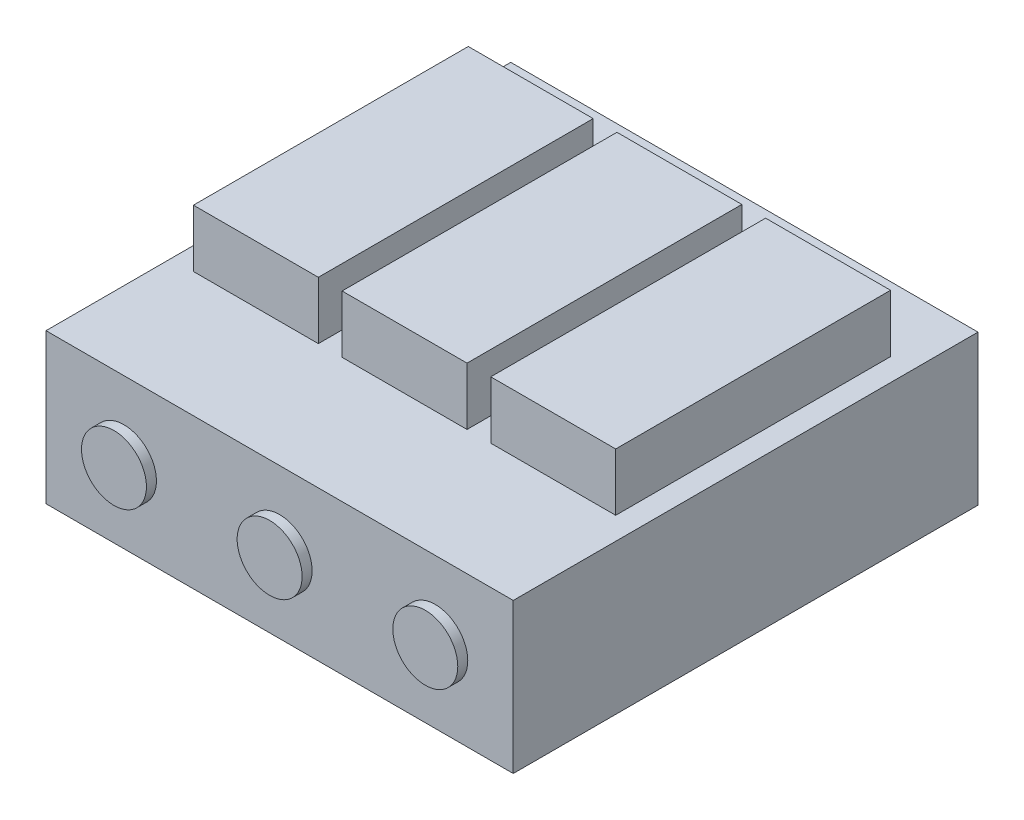
ISO-10303-21;
HEADER;
FILE_DESCRIPTION(('STEP AP214'),'2;1');
FILE_NAME('part.step','',(''),(''),'','','');
FILE_SCHEMA(('AUTOMOTIVE_DESIGN { 1 0 10303 214 1 1 1 1 }'));
ENDSEC;
DATA;
#1=APPLICATION_CONTEXT('core data for automotive mechanical design processes');
#2=APPLICATION_PROTOCOL_DEFINITION('international standard','automotive_design',2000,#1);
#3=PRODUCT_CONTEXT('',#1,'mechanical');
#4=PRODUCT('Part','Part','',(#3));
#5=PRODUCT_RELATED_PRODUCT_CATEGORY('part','',(#4));
#6=PRODUCT_DEFINITION_FORMATION('','',#4);
#7=PRODUCT_DEFINITION_CONTEXT('part definition',#1,'design');
#8=PRODUCT_DEFINITION('design','',#6,#7);
#9=PRODUCT_DEFINITION_SHAPE('','',#8);
#10=(LENGTH_UNIT() NAMED_UNIT(*) SI_UNIT(.MILLI.,.METRE.));
#11=(NAMED_UNIT(*) PLANE_ANGLE_UNIT() SI_UNIT($,.RADIAN.));
#12=(NAMED_UNIT(*) SI_UNIT($,.STERADIAN.) SOLID_ANGLE_UNIT());
#13=UNCERTAINTY_MEASURE_WITH_UNIT(LENGTH_MEASURE(1.E-05),#10,'distance_accuracy_value','');
#14=(GEOMETRIC_REPRESENTATION_CONTEXT(3) GLOBAL_UNCERTAINTY_ASSIGNED_CONTEXT((#13)) GLOBAL_UNIT_ASSIGNED_CONTEXT((#10,
#11,#12)) REPRESENTATION_CONTEXT('',''));
#15=CARTESIAN_POINT('',(0.,0.,0.));
#16=DIRECTION('',(0.,0.,1.));
#17=DIRECTION('',(1.,0.,0.));
#18=AXIS2_PLACEMENT_3D('',#15,#16,#17);
#19=CARTESIAN_POINT('',(15.58,3.,0.4));
#20=DIRECTION('',(0.,0.,-1.));
#21=DIRECTION('',(-1.,0.,0.));
#22=AXIS2_PLACEMENT_3D('',#19,#20,#21);
#23=CYLINDRICAL_SURFACE('',#22,1.3);
#24=CARTESIAN_POINT('',(15.58,3.,0.4));
#25=DIRECTION('',(0.,0.,1.));
#26=DIRECTION('',(1.,0.,0.));
#27=AXIS2_PLACEMENT_3D('',#24,#25,#26);
#28=CIRCLE('',#27,1.3);
#29=CARTESIAN_POINT('',(16.88,3.,0.4));
#30=VERTEX_POINT('',#29);
#31=EDGE_CURVE('E59',#30,#30,#28,.T.);
#32=ORIENTED_EDGE('',*,*,#31,.F.);
#33=EDGE_LOOP('',(#32));
#34=FACE_BOUND('',#33,.T.);
#35=CARTESIAN_POINT('',(15.58,3.,0.));
#36=DIRECTION('',(0.,0.,1.));
#37=DIRECTION('',(1.,0.,0.));
#38=AXIS2_PLACEMENT_3D('',#35,#36,#37);
#39=CIRCLE('',#38,1.3);
#40=CARTESIAN_POINT('',(16.88,3.,0.));
#41=VERTEX_POINT('',#40);
#42=EDGE_CURVE('E11',#41,#41,#39,.T.);
#43=ORIENTED_EDGE('',*,*,#42,.T.);
#44=EDGE_LOOP('',(#43));
#45=FACE_BOUND('',#44,.T.);
#46=ADVANCED_FACE('F53',(#34,#45),#23,.T.);
#47=CARTESIAN_POINT('',(15.58,3.,0.4));
#48=DIRECTION('',(0.,0.,1.));
#49=DIRECTION('',(1.,0.,0.));
#50=AXIS2_PLACEMENT_3D('',#47,#48,#49);
#51=PLANE('',#50);
#52=ORIENTED_EDGE('',*,*,#31,.T.);
#53=EDGE_LOOP('',(#52));
#54=FACE_BOUND('',#53,.T.);
#55=ADVANCED_FACE('F57',(#54),#51,.T.);
#56=CARTESIAN_POINT('',(15.58,3.,0.));
#57=DIRECTION('',(0.,0.,1.));
#58=DIRECTION('',(1.,0.,0.));
#59=AXIS2_PLACEMENT_3D('',#56,#57,#58);
#60=PLANE('',#59);
#61=ORIENTED_EDGE('',*,*,#42,.F.);
#62=EDGE_LOOP('',(#61));
#63=FACE_BOUND('',#62,.T.);
#64=ADVANCED_FACE('F71',(#63),#60,.F.);
#65=CLOSED_SHELL('',(#46,#55,#64));
#66=MANIFOLD_SOLID_BREP('B2',#65);
#67=CARTESIAN_POINT('',(9.35,3.,0.4));
#68=DIRECTION('',(0.,0.,-1.));
#69=DIRECTION('',(-1.,0.,0.));
#70=AXIS2_PLACEMENT_3D('',#67,#68,#69);
#71=CYLINDRICAL_SURFACE('',#70,1.3);
#72=CARTESIAN_POINT('',(9.35,3.,0.4));
#73=DIRECTION('',(0.,0.,1.));
#74=DIRECTION('',(1.,0.,0.));
#75=AXIS2_PLACEMENT_3D('',#72,#73,#74);
#76=CIRCLE('',#75,1.3);
#77=CARTESIAN_POINT('',(10.65,3.,0.4));
#78=VERTEX_POINT('',#77);
#79=EDGE_CURVE('E116',#78,#78,#76,.T.);
#80=ORIENTED_EDGE('',*,*,#79,.F.);
#81=EDGE_LOOP('',(#80));
#82=FACE_BOUND('',#81,.T.);
#83=CARTESIAN_POINT('',(9.35,3.,0.));
#84=DIRECTION('',(0.,0.,1.));
#85=DIRECTION('',(1.,0.,0.));
#86=AXIS2_PLACEMENT_3D('',#83,#84,#85);
#87=CIRCLE('',#86,1.3);
#88=CARTESIAN_POINT('',(10.65,3.,0.));
#89=VERTEX_POINT('',#88);
#90=EDGE_CURVE('E52',#89,#89,#87,.T.);
#91=ORIENTED_EDGE('',*,*,#90,.T.);
#92=EDGE_LOOP('',(#91));
#93=FACE_BOUND('',#92,.T.);
#94=ADVANCED_FACE('F113',(#82,#93),#71,.T.);
#95=CARTESIAN_POINT('',(9.35,3.,0.4));
#96=DIRECTION('',(0.,0.,1.));
#97=DIRECTION('',(1.,0.,0.));
#98=AXIS2_PLACEMENT_3D('',#95,#96,#97);
#99=PLANE('',#98);
#100=ORIENTED_EDGE('',*,*,#79,.T.);
#101=EDGE_LOOP('',(#100));
#102=FACE_BOUND('',#101,.T.);
#103=ADVANCED_FACE('F120',(#102),#99,.T.);
#104=CARTESIAN_POINT('',(9.35,3.,0.));
#105=DIRECTION('',(0.,0.,1.));
#106=DIRECTION('',(1.,0.,0.));
#107=AXIS2_PLACEMENT_3D('',#104,#105,#106);
#108=PLANE('',#107);
#109=ORIENTED_EDGE('',*,*,#90,.F.);
#110=EDGE_LOOP('',(#109));
#111=FACE_BOUND('',#110,.T.);
#112=ADVANCED_FACE('F131',(#111),#108,.F.);
#113=CLOSED_SHELL('',(#94,#103,#112));
#114=MANIFOLD_SOLID_BREP('B6',#113);
#115=CARTESIAN_POINT('',(3.12,3.,0.4));
#116=DIRECTION('',(0.,0.,-1.));
#117=DIRECTION('',(-1.,0.,0.));
#118=AXIS2_PLACEMENT_3D('',#115,#116,#117);
#119=CYLINDRICAL_SURFACE('',#118,1.3);
#120=CARTESIAN_POINT('',(3.12,3.,0.4));
#121=DIRECTION('',(0.,0.,1.));
#122=DIRECTION('',(1.,0.,0.));
#123=AXIS2_PLACEMENT_3D('',#120,#121,#122);
#124=CIRCLE('',#123,1.3);
#125=CARTESIAN_POINT('',(4.42,3.,0.4));
#126=VERTEX_POINT('',#125);
#127=EDGE_CURVE('E111',#126,#126,#124,.T.);
#128=ORIENTED_EDGE('',*,*,#127,.F.);
#129=EDGE_LOOP('',(#128));
#130=FACE_BOUND('',#129,.T.);
#131=CARTESIAN_POINT('',(3.12,3.,0.));
#132=DIRECTION('',(0.,0.,1.));
#133=DIRECTION('',(1.,0.,0.));
#134=AXIS2_PLACEMENT_3D('',#131,#132,#133);
#135=CIRCLE('',#134,1.3);
#136=CARTESIAN_POINT('',(4.42,3.,0.));
#137=VERTEX_POINT('',#136);
#138=EDGE_CURVE('E182',#137,#137,#135,.T.);
#139=ORIENTED_EDGE('',*,*,#138,.T.);
#140=EDGE_LOOP('',(#139));
#141=FACE_BOUND('',#140,.T.);
#142=ADVANCED_FACE('F178',(#130,#141),#119,.T.);
#143=CARTESIAN_POINT('',(3.12,3.,0.4));
#144=DIRECTION('',(0.,0.,1.));
#145=DIRECTION('',(1.,0.,0.));
#146=AXIS2_PLACEMENT_3D('',#143,#144,#145);
#147=PLANE('',#146);
#148=ORIENTED_EDGE('',*,*,#127,.T.);
#149=EDGE_LOOP('',(#148));
#150=FACE_BOUND('',#149,.T.);
#151=ADVANCED_FACE('F193',(#150),#147,.T.);
#152=CARTESIAN_POINT('',(3.12,3.,0.));
#153=DIRECTION('',(0.,0.,1.));
#154=DIRECTION('',(1.,0.,0.));
#155=AXIS2_PLACEMENT_3D('',#152,#153,#154);
#156=PLANE('',#155);
#157=ORIENTED_EDGE('',*,*,#138,.F.);
#158=EDGE_LOOP('',(#157));
#159=FACE_BOUND('',#158,.T.);
#160=ADVANCED_FACE('F192',(#159),#156,.F.);
#161=CLOSED_SHELL('',(#142,#151,#160));
#162=MANIFOLD_SOLID_BREP('B48',#161);
#163=CARTESIAN_POINT('',(12.8,8.3,-16.));
#164=DIRECTION('',(1.,0.,0.));
#165=DIRECTION('',(0.,0.,-1.));
#166=AXIS2_PLACEMENT_3D('',#163,#164,#165);
#167=PLANE('',#166);
#168=DIRECTION('',(0.,0.,1.));
#169=VECTOR('',#168,1.);
#170=CARTESIAN_POINT('',(12.8,6.,-16.));
#171=LINE('',#170,#169);
#172=CARTESIAN_POINT('',(12.8,6.,-16.));
#173=VERTEX_POINT('',#172);
#174=CARTESIAN_POINT('',(12.8,6.,-5.));
#175=VERTEX_POINT('',#174);
#176=EDGE_CURVE('E177',#173,#175,#171,.T.);
#177=ORIENTED_EDGE('',*,*,#176,.T.);
#178=DIRECTION('',(0.,-1.,0.));
#179=VECTOR('',#178,1.);
#180=CARTESIAN_POINT('',(12.8,8.3,-5.));
#181=LINE('',#180,#179);
#182=CARTESIAN_POINT('',(12.8,8.3,-5.));
#183=VERTEX_POINT('',#182);
#184=EDGE_CURVE('E315',#183,#175,#181,.T.);
#185=ORIENTED_EDGE('',*,*,#184,.F.);
#186=DIRECTION('',(0.,0.,1.));
#187=VECTOR('',#186,1.);
#188=CARTESIAN_POINT('',(12.8,8.3,-16.));
#189=LINE('',#188,#187);
#190=CARTESIAN_POINT('',(12.8,8.3,-16.));
#191=VERTEX_POINT('',#190);
#192=EDGE_CURVE('E243',#191,#183,#189,.T.);
#193=ORIENTED_EDGE('',*,*,#192,.F.);
#194=DIRECTION('',(0.,-1.,0.));
#195=VECTOR('',#194,1.);
#196=CARTESIAN_POINT('',(12.8,8.3,-16.));
#197=LINE('',#196,#195);
#198=EDGE_CURVE('E298',#191,#173,#197,.T.);
#199=ORIENTED_EDGE('',*,*,#198,.T.);
#200=EDGE_LOOP('',(#177,#185,#193,#199));
#201=FACE_BOUND('',#200,.T.);
#202=ADVANCED_FACE('F242',(#201),#167,.F.);
#203=CARTESIAN_POINT('',(12.8,8.3,-5.));
#204=DIRECTION('',(0.,0.,-1.));
#205=DIRECTION('',(-1.,0.,0.));
#206=AXIS2_PLACEMENT_3D('',#203,#204,#205);
#207=PLANE('',#206);
#208=DIRECTION('',(1.,0.,0.));
#209=VECTOR('',#208,1.);
#210=CARTESIAN_POINT('',(12.8,6.,-5.));
#211=LINE('',#210,#209);
#212=CARTESIAN_POINT('',(17.8,6.,-5.));
#213=VERTEX_POINT('',#212);
#214=EDGE_CURVE('E253',#175,#213,#211,.T.);
#215=ORIENTED_EDGE('',*,*,#214,.T.);
#216=DIRECTION('',(0.,-1.,0.));
#217=VECTOR('',#216,1.);
#218=CARTESIAN_POINT('',(17.8,8.3,-5.));
#219=LINE('',#218,#217);
#220=CARTESIAN_POINT('',(17.8,8.3,-5.));
#221=VERTEX_POINT('',#220);
#222=EDGE_CURVE('E297',#221,#213,#219,.T.);
#223=ORIENTED_EDGE('',*,*,#222,.F.);
#224=DIRECTION('',(1.,0.,0.));
#225=VECTOR('',#224,1.);
#226=CARTESIAN_POINT('',(12.8,8.3,-5.));
#227=LINE('',#226,#225);
#228=EDGE_CURVE('E274',#183,#221,#227,.T.);
#229=ORIENTED_EDGE('',*,*,#228,.F.);
#230=ORIENTED_EDGE('',*,*,#184,.T.);
#231=EDGE_LOOP('',(#215,#223,#229,#230));
#232=FACE_BOUND('',#231,.T.);
#233=ADVANCED_FACE('F312',(#232),#207,.F.);
#234=CARTESIAN_POINT('',(17.8,8.3,-16.));
#235=DIRECTION('',(-1.,0.,0.));
#236=DIRECTION('',(0.,0.,1.));
#237=AXIS2_PLACEMENT_3D('',#234,#235,#236);
#238=PLANE('',#237);
#239=DIRECTION('',(0.,0.,-1.));
#240=VECTOR('',#239,1.);
#241=CARTESIAN_POINT('',(17.8,6.,-16.));
#242=LINE('',#241,#240);
#243=CARTESIAN_POINT('',(17.8,6.,-16.));
#244=VERTEX_POINT('',#243);
#245=EDGE_CURVE('E292',#213,#244,#242,.T.);
#246=ORIENTED_EDGE('',*,*,#245,.T.);
#247=DIRECTION('',(0.,-1.,0.));
#248=VECTOR('',#247,1.);
#249=CARTESIAN_POINT('',(17.8,8.3,-16.));
#250=LINE('',#249,#248);
#251=CARTESIAN_POINT('',(17.8,8.3,-16.));
#252=VERTEX_POINT('',#251);
#253=EDGE_CURVE('E294',#252,#244,#250,.T.);
#254=ORIENTED_EDGE('',*,*,#253,.F.);
#255=DIRECTION('',(0.,0.,-1.));
#256=VECTOR('',#255,1.);
#257=CARTESIAN_POINT('',(17.8,8.3,-16.));
#258=LINE('',#257,#256);
#259=EDGE_CURVE('E306',#221,#252,#258,.T.);
#260=ORIENTED_EDGE('',*,*,#259,.F.);
#261=ORIENTED_EDGE('',*,*,#222,.T.);
#262=EDGE_LOOP('',(#246,#254,#260,#261));
#263=FACE_BOUND('',#262,.T.);
#264=ADVANCED_FACE('F295',(#263),#238,.F.);
#265=CARTESIAN_POINT('',(12.8,8.3,-16.));
#266=DIRECTION('',(0.,0.,1.));
#267=DIRECTION('',(1.,0.,0.));
#268=AXIS2_PLACEMENT_3D('',#265,#266,#267);
#269=PLANE('',#268);
#270=DIRECTION('',(-1.,0.,0.));
#271=VECTOR('',#270,1.);
#272=CARTESIAN_POINT('',(12.8,6.,-16.));
#273=LINE('',#272,#271);
#274=EDGE_CURVE('E283',#244,#173,#273,.T.);
#275=ORIENTED_EDGE('',*,*,#274,.T.);
#276=ORIENTED_EDGE('',*,*,#198,.F.);
#277=DIRECTION('',(-1.,0.,0.));
#278=VECTOR('',#277,1.);
#279=CARTESIAN_POINT('',(12.8,8.3,-16.));
#280=LINE('',#279,#278);
#281=EDGE_CURVE('E296',#252,#191,#280,.T.);
#282=ORIENTED_EDGE('',*,*,#281,.F.);
#283=ORIENTED_EDGE('',*,*,#253,.T.);
#284=EDGE_LOOP('',(#275,#276,#282,#283));
#285=FACE_BOUND('',#284,.T.);
#286=ADVANCED_FACE('F299',(#285),#269,.F.);
#287=CARTESIAN_POINT('',(0.,8.3,0.));
#288=DIRECTION('',(0.,1.,0.));
#289=DIRECTION('',(0.,0.,1.));
#290=AXIS2_PLACEMENT_3D('',#287,#288,#289);
#291=PLANE('',#290);
#292=ORIENTED_EDGE('',*,*,#192,.T.);
#293=ORIENTED_EDGE('',*,*,#228,.T.);
#294=ORIENTED_EDGE('',*,*,#259,.T.);
#295=ORIENTED_EDGE('',*,*,#281,.T.);
#296=EDGE_LOOP('',(#292,#293,#294,#295));
#297=FACE_BOUND('',#296,.T.);
#298=ADVANCED_FACE('F244',(#297),#291,.T.);
#299=CARTESIAN_POINT('',(0.,6.,0.));
#300=DIRECTION('',(0.,1.,0.));
#301=DIRECTION('',(0.,0.,1.));
#302=AXIS2_PLACEMENT_3D('',#299,#300,#301);
#303=PLANE('',#302);
#304=ORIENTED_EDGE('',*,*,#176,.F.);
#305=ORIENTED_EDGE('',*,*,#274,.F.);
#306=ORIENTED_EDGE('',*,*,#245,.F.);
#307=ORIENTED_EDGE('',*,*,#214,.F.);
#308=EDGE_LOOP('',(#304,#305,#306,#307));
#309=FACE_BOUND('',#308,.T.);
#310=ADVANCED_FACE('F305',(#309),#303,.F.);
#311=CLOSED_SHELL('',(#202,#233,#264,#286,#298,#310));
#312=MANIFOLD_SOLID_BREP('B108',#311);
#313=CARTESIAN_POINT('',(6.85,8.3,-16.));
#314=DIRECTION('',(1.,0.,0.));
#315=DIRECTION('',(0.,0.,-1.));
#316=AXIS2_PLACEMENT_3D('',#313,#314,#315);
#317=PLANE('',#316);
#318=DIRECTION('',(0.,0.,1.));
#319=VECTOR('',#318,1.);
#320=CARTESIAN_POINT('',(6.85,6.,-16.));
#321=LINE('',#320,#319);
#322=CARTESIAN_POINT('',(6.85,6.,-16.));
#323=VERTEX_POINT('',#322);
#324=CARTESIAN_POINT('',(6.85,6.,-5.));
#325=VERTEX_POINT('',#324);
#326=EDGE_CURVE('E239',#323,#325,#321,.T.);
#327=ORIENTED_EDGE('',*,*,#326,.T.);
#328=DIRECTION('',(0.,-1.,0.));
#329=VECTOR('',#328,1.);
#330=CARTESIAN_POINT('',(6.85,8.3,-5.));
#331=LINE('',#330,#329);
#332=CARTESIAN_POINT('',(6.85,8.3,-5.));
#333=VERTEX_POINT('',#332);
#334=EDGE_CURVE('E466',#333,#325,#331,.T.);
#335=ORIENTED_EDGE('',*,*,#334,.F.);
#336=DIRECTION('',(0.,0.,1.));
#337=VECTOR('',#336,1.);
#338=CARTESIAN_POINT('',(6.85,8.3,-16.));
#339=LINE('',#338,#337);
#340=CARTESIAN_POINT('',(6.85,8.3,-16.));
#341=VERTEX_POINT('',#340);
#342=EDGE_CURVE('E401',#341,#333,#339,.T.);
#343=ORIENTED_EDGE('',*,*,#342,.F.);
#344=DIRECTION('',(0.,-1.,0.));
#345=VECTOR('',#344,1.);
#346=CARTESIAN_POINT('',(6.85,8.3,-16.));
#347=LINE('',#346,#345);
#348=EDGE_CURVE('E456',#341,#323,#347,.T.);
#349=ORIENTED_EDGE('',*,*,#348,.T.);
#350=EDGE_LOOP('',(#327,#335,#343,#349));
#351=FACE_BOUND('',#350,.T.);
#352=ADVANCED_FACE('F399',(#351),#317,.F.);
#353=CARTESIAN_POINT('',(6.85,8.3,-5.));
#354=DIRECTION('',(0.,0.,-1.));
#355=DIRECTION('',(-1.,0.,0.));
#356=AXIS2_PLACEMENT_3D('',#353,#354,#355);
#357=PLANE('',#356);
#358=DIRECTION('',(1.,0.,0.));
#359=VECTOR('',#358,1.);
#360=CARTESIAN_POINT('',(6.85,6.,-5.));
#361=LINE('',#360,#359);
#362=CARTESIAN_POINT('',(11.85,6.,-5.));
#363=VERTEX_POINT('',#362);
#364=EDGE_CURVE('E406',#325,#363,#361,.T.);
#365=ORIENTED_EDGE('',*,*,#364,.T.);
#366=DIRECTION('',(0.,-1.,0.));
#367=VECTOR('',#366,1.);
#368=CARTESIAN_POINT('',(11.85,8.3,-5.));
#369=LINE('',#368,#367);
#370=CARTESIAN_POINT('',(11.85,8.3,-5.));
#371=VERTEX_POINT('',#370);
#372=EDGE_CURVE('E454',#371,#363,#369,.T.);
#373=ORIENTED_EDGE('',*,*,#372,.F.);
#374=DIRECTION('',(1.,0.,0.));
#375=VECTOR('',#374,1.);
#376=CARTESIAN_POINT('',(6.85,8.3,-5.));
#377=LINE('',#376,#375);
#378=EDGE_CURVE('E433',#333,#371,#377,.T.);
#379=ORIENTED_EDGE('',*,*,#378,.F.);
#380=ORIENTED_EDGE('',*,*,#334,.T.);
#381=EDGE_LOOP('',(#365,#373,#379,#380));
#382=FACE_BOUND('',#381,.T.);
#383=ADVANCED_FACE('F471',(#382),#357,.F.);
#384=CARTESIAN_POINT('',(11.85,8.3,-16.));
#385=DIRECTION('',(-1.,0.,0.));
#386=DIRECTION('',(0.,0.,1.));
#387=AXIS2_PLACEMENT_3D('',#384,#385,#386);
#388=PLANE('',#387);
#389=DIRECTION('',(0.,0.,-1.));
#390=VECTOR('',#389,1.);
#391=CARTESIAN_POINT('',(11.85,6.,-16.));
#392=LINE('',#391,#390);
#393=CARTESIAN_POINT('',(11.85,6.,-16.));
#394=VERTEX_POINT('',#393);
#395=EDGE_CURVE('E446',#363,#394,#392,.T.);
#396=ORIENTED_EDGE('',*,*,#395,.T.);
#397=DIRECTION('',(0.,-1.,0.));
#398=VECTOR('',#397,1.);
#399=CARTESIAN_POINT('',(11.85,8.3,-16.));
#400=LINE('',#399,#398);
#401=CARTESIAN_POINT('',(11.85,8.3,-16.));
#402=VERTEX_POINT('',#401);
#403=EDGE_CURVE('E455',#402,#394,#400,.T.);
#404=ORIENTED_EDGE('',*,*,#403,.F.);
#405=DIRECTION('',(0.,0.,-1.));
#406=VECTOR('',#405,1.);
#407=CARTESIAN_POINT('',(11.85,8.3,-16.));
#408=LINE('',#407,#406);
#409=EDGE_CURVE('E467',#371,#402,#408,.T.);
#410=ORIENTED_EDGE('',*,*,#409,.F.);
#411=ORIENTED_EDGE('',*,*,#372,.T.);
#412=EDGE_LOOP('',(#396,#404,#410,#411));
#413=FACE_BOUND('',#412,.T.);
#414=ADVANCED_FACE('F448',(#413),#388,.F.);
#415=CARTESIAN_POINT('',(6.85,8.3,-16.));
#416=DIRECTION('',(0.,0.,1.));
#417=DIRECTION('',(1.,0.,0.));
#418=AXIS2_PLACEMENT_3D('',#415,#416,#417);
#419=PLANE('',#418);
#420=DIRECTION('',(-1.,0.,0.));
#421=VECTOR('',#420,1.);
#422=CARTESIAN_POINT('',(6.85,6.,-16.));
#423=LINE('',#422,#421);
#424=EDGE_CURVE('E444',#394,#323,#423,.T.);
#425=ORIENTED_EDGE('',*,*,#424,.T.);
#426=ORIENTED_EDGE('',*,*,#348,.F.);
#427=DIRECTION('',(-1.,0.,0.));
#428=VECTOR('',#427,1.);
#429=CARTESIAN_POINT('',(6.85,8.3,-16.));
#430=LINE('',#429,#428);
#431=EDGE_CURVE('E460',#402,#341,#430,.T.);
#432=ORIENTED_EDGE('',*,*,#431,.F.);
#433=ORIENTED_EDGE('',*,*,#403,.T.);
#434=EDGE_LOOP('',(#425,#426,#432,#433));
#435=FACE_BOUND('',#434,.T.);
#436=ADVANCED_FACE('F457',(#435),#419,.F.);
#437=CARTESIAN_POINT('',(0.,8.3,0.));
#438=DIRECTION('',(0.,1.,0.));
#439=DIRECTION('',(0.,0.,1.));
#440=AXIS2_PLACEMENT_3D('',#437,#438,#439);
#441=PLANE('',#440);
#442=ORIENTED_EDGE('',*,*,#342,.T.);
#443=ORIENTED_EDGE('',*,*,#378,.T.);
#444=ORIENTED_EDGE('',*,*,#409,.T.);
#445=ORIENTED_EDGE('',*,*,#431,.T.);
#446=EDGE_LOOP('',(#442,#443,#444,#445));
#447=FACE_BOUND('',#446,.T.);
#448=ADVANCED_FACE('F402',(#447),#441,.T.);
#449=CARTESIAN_POINT('',(0.,6.,0.));
#450=DIRECTION('',(0.,1.,0.));
#451=DIRECTION('',(0.,0.,1.));
#452=AXIS2_PLACEMENT_3D('',#449,#450,#451);
#453=PLANE('',#452);
#454=ORIENTED_EDGE('',*,*,#326,.F.);
#455=ORIENTED_EDGE('',*,*,#424,.F.);
#456=ORIENTED_EDGE('',*,*,#395,.F.);
#457=ORIENTED_EDGE('',*,*,#364,.F.);
#458=EDGE_LOOP('',(#454,#455,#456,#457));
#459=FACE_BOUND('',#458,.T.);
#460=ADVANCED_FACE('F458',(#459),#453,.F.);
#461=CLOSED_SHELL('',(#352,#383,#414,#436,#448,#460));
#462=MANIFOLD_SOLID_BREP('B168',#461);
#463=CARTESIAN_POINT('',(0.9,8.3,-16.));
#464=DIRECTION('',(1.,0.,0.));
#465=DIRECTION('',(0.,0.,-1.));
#466=AXIS2_PLACEMENT_3D('',#463,#464,#465);
#467=PLANE('',#466);
#468=DIRECTION('',(0.,0.,1.));
#469=VECTOR('',#468,1.);
#470=CARTESIAN_POINT('',(0.9,6.,-16.));
#471=LINE('',#470,#469);
#472=CARTESIAN_POINT('',(0.9,6.,-16.));
#473=VERTEX_POINT('',#472);
#474=CARTESIAN_POINT('',(0.9,6.,-5.));
#475=VERTEX_POINT('',#474);
#476=EDGE_CURVE('E619',#473,#475,#471,.T.);
#477=ORIENTED_EDGE('',*,*,#476,.T.);
#478=DIRECTION('',(0.,-1.,0.));
#479=VECTOR('',#478,1.);
#480=CARTESIAN_POINT('',(0.9,8.3,-5.));
#481=LINE('',#480,#479);
#482=CARTESIAN_POINT('',(0.9,8.3,-5.));
#483=VERTEX_POINT('',#482);
#484=EDGE_CURVE('E400',#483,#475,#481,.T.);
#485=ORIENTED_EDGE('',*,*,#484,.F.);
#486=DIRECTION('',(0.,0.,1.));
#487=VECTOR('',#486,1.);
#488=CARTESIAN_POINT('',(0.9,8.3,-16.));
#489=LINE('',#488,#487);
#490=CARTESIAN_POINT('',(0.9,8.3,-16.));
#491=VERTEX_POINT('',#490);
#492=EDGE_CURVE('E610',#491,#483,#489,.T.);
#493=ORIENTED_EDGE('',*,*,#492,.F.);
#494=DIRECTION('',(0.,-1.,0.));
#495=VECTOR('',#494,1.);
#496=CARTESIAN_POINT('',(0.9,8.3,-16.));
#497=LINE('',#496,#495);
#498=EDGE_CURVE('E613',#491,#473,#497,.T.);
#499=ORIENTED_EDGE('',*,*,#498,.T.);
#500=EDGE_LOOP('',(#477,#485,#493,#499));
#501=FACE_BOUND('',#500,.T.);
#502=ADVANCED_FACE('F557',(#501),#467,.F.);
#503=CARTESIAN_POINT('',(0.9,8.3,-5.));
#504=DIRECTION('',(0.,0.,-1.));
#505=DIRECTION('',(-1.,0.,0.));
#506=AXIS2_PLACEMENT_3D('',#503,#504,#505);
#507=PLANE('',#506);
#508=DIRECTION('',(1.,0.,0.));
#509=VECTOR('',#508,1.);
#510=CARTESIAN_POINT('',(0.9,6.,-5.));
#511=LINE('',#510,#509);
#512=CARTESIAN_POINT('',(5.9,6.,-5.));
#513=VERTEX_POINT('',#512);
#514=EDGE_CURVE('E612',#475,#513,#511,.T.);
#515=ORIENTED_EDGE('',*,*,#514,.T.);
#516=DIRECTION('',(0.,-1.,0.));
#517=VECTOR('',#516,1.);
#518=CARTESIAN_POINT('',(5.9,8.3,-5.));
#519=LINE('',#518,#517);
#520=CARTESIAN_POINT('',(5.9,8.3,-5.));
#521=VERTEX_POINT('',#520);
#522=EDGE_CURVE('E564',#521,#513,#519,.T.);
#523=ORIENTED_EDGE('',*,*,#522,.F.);
#524=DIRECTION('',(1.,0.,0.));
#525=VECTOR('',#524,1.);
#526=CARTESIAN_POINT('',(0.9,8.3,-5.));
#527=LINE('',#526,#525);
#528=EDGE_CURVE('E605',#483,#521,#527,.T.);
#529=ORIENTED_EDGE('',*,*,#528,.F.);
#530=ORIENTED_EDGE('',*,*,#484,.T.);
#531=EDGE_LOOP('',(#515,#523,#529,#530));
#532=FACE_BOUND('',#531,.T.);
#533=ADVANCED_FACE('F608',(#532),#507,.F.);
#534=CARTESIAN_POINT('',(5.9,8.3,-16.));
#535=DIRECTION('',(-1.,0.,0.));
#536=DIRECTION('',(0.,0.,1.));
#537=AXIS2_PLACEMENT_3D('',#534,#535,#536);
#538=PLANE('',#537);
#539=DIRECTION('',(0.,0.,-1.));
#540=VECTOR('',#539,1.);
#541=CARTESIAN_POINT('',(5.9,6.,-16.));
#542=LINE('',#541,#540);
#543=CARTESIAN_POINT('',(5.9,6.,-16.));
#544=VERTEX_POINT('',#543);
#545=EDGE_CURVE('E589',#513,#544,#542,.T.);
#546=ORIENTED_EDGE('',*,*,#545,.T.);
#547=DIRECTION('',(0.,-1.,0.));
#548=VECTOR('',#547,1.);
#549=CARTESIAN_POINT('',(5.9,8.3,-16.));
#550=LINE('',#549,#548);
#551=CARTESIAN_POINT('',(5.9,8.3,-16.));
#552=VERTEX_POINT('',#551);
#553=EDGE_CURVE('E615',#552,#544,#550,.T.);
#554=ORIENTED_EDGE('',*,*,#553,.F.);
#555=DIRECTION('',(0.,0.,-1.));
#556=VECTOR('',#555,1.);
#557=CARTESIAN_POINT('',(5.9,8.3,-16.));
#558=LINE('',#557,#556);
#559=EDGE_CURVE('E604',#521,#552,#558,.T.);
#560=ORIENTED_EDGE('',*,*,#559,.F.);
#561=ORIENTED_EDGE('',*,*,#522,.T.);
#562=EDGE_LOOP('',(#546,#554,#560,#561));
#563=FACE_BOUND('',#562,.T.);
#564=ADVANCED_FACE('F614',(#563),#538,.F.);
#565=CARTESIAN_POINT('',(0.9,8.3,-16.));
#566=DIRECTION('',(0.,0.,1.));
#567=DIRECTION('',(1.,0.,0.));
#568=AXIS2_PLACEMENT_3D('',#565,#566,#567);
#569=PLANE('',#568);
#570=DIRECTION('',(-1.,0.,0.));
#571=VECTOR('',#570,1.);
#572=CARTESIAN_POINT('',(0.9,6.,-16.));
#573=LINE('',#572,#571);
#574=EDGE_CURVE('E594',#544,#473,#573,.T.);
#575=ORIENTED_EDGE('',*,*,#574,.T.);
#576=ORIENTED_EDGE('',*,*,#498,.F.);
#577=DIRECTION('',(-1.,0.,0.));
#578=VECTOR('',#577,1.);
#579=CARTESIAN_POINT('',(0.9,8.3,-16.));
#580=LINE('',#579,#578);
#581=EDGE_CURVE('E575',#552,#491,#580,.T.);
#582=ORIENTED_EDGE('',*,*,#581,.F.);
#583=ORIENTED_EDGE('',*,*,#553,.T.);
#584=EDGE_LOOP('',(#575,#576,#582,#583));
#585=FACE_BOUND('',#584,.T.);
#586=ADVANCED_FACE('F627',(#585),#569,.F.);
#587=CARTESIAN_POINT('',(0.,8.3,0.));
#588=DIRECTION('',(0.,1.,0.));
#589=DIRECTION('',(0.,0.,1.));
#590=AXIS2_PLACEMENT_3D('',#587,#588,#589);
#591=PLANE('',#590);
#592=ORIENTED_EDGE('',*,*,#492,.T.);
#593=ORIENTED_EDGE('',*,*,#528,.T.);
#594=ORIENTED_EDGE('',*,*,#559,.T.);
#595=ORIENTED_EDGE('',*,*,#581,.T.);
#596=EDGE_LOOP('',(#592,#593,#594,#595));
#597=FACE_BOUND('',#596,.T.);
#598=ADVANCED_FACE('F602',(#597),#591,.T.);
#599=CARTESIAN_POINT('',(0.,6.,0.));
#600=DIRECTION('',(0.,1.,0.));
#601=DIRECTION('',(0.,0.,1.));
#602=AXIS2_PLACEMENT_3D('',#599,#600,#601);
#603=PLANE('',#602);
#604=ORIENTED_EDGE('',*,*,#476,.F.);
#605=ORIENTED_EDGE('',*,*,#574,.F.);
#606=ORIENTED_EDGE('',*,*,#545,.F.);
#607=ORIENTED_EDGE('',*,*,#514,.F.);
#608=EDGE_LOOP('',(#604,#605,#606,#607));
#609=FACE_BOUND('',#608,.T.);
#610=ADVANCED_FACE('F626',(#609),#603,.F.);
#611=CLOSED_SHELL('',(#502,#533,#564,#586,#598,#610));
#612=MANIFOLD_SOLID_BREP('B233',#611);
#613=CARTESIAN_POINT('',(0.,6.,-18.6));
#614=DIRECTION('',(1.,0.,0.));
#615=DIRECTION('',(0.,0.,-1.));
#616=AXIS2_PLACEMENT_3D('',#613,#614,#615);
#617=PLANE('',#616);
#618=DIRECTION('',(0.,0.,1.));
#619=VECTOR('',#618,1.);
#620=CARTESIAN_POINT('',(0.,0.,-18.6));
#621=LINE('',#620,#619);
#622=CARTESIAN_POINT('',(0.,0.,-18.6));
#623=VERTEX_POINT('',#622);
#624=CARTESIAN_POINT('',(0.,0.,0.));
#625=VERTEX_POINT('',#624);
#626=EDGE_CURVE('E770',#623,#625,#621,.T.);
#627=ORIENTED_EDGE('',*,*,#626,.T.);
#628=DIRECTION('',(0.,-1.,0.));
#629=VECTOR('',#628,1.);
#630=CARTESIAN_POINT('',(0.,6.,0.));
#631=LINE('',#630,#629);
#632=CARTESIAN_POINT('',(0.,6.,0.));
#633=VERTEX_POINT('',#632);
#634=EDGE_CURVE('E551',#633,#625,#631,.T.);
#635=ORIENTED_EDGE('',*,*,#634,.F.);
#636=DIRECTION('',(0.,0.,1.));
#637=VECTOR('',#636,1.);
#638=CARTESIAN_POINT('',(0.,6.,-18.6));
#639=LINE('',#638,#637);
#640=CARTESIAN_POINT('',(0.,6.,-18.6));
#641=VERTEX_POINT('',#640);
#642=EDGE_CURVE('E752',#641,#633,#639,.T.);
#643=ORIENTED_EDGE('',*,*,#642,.F.);
#644=DIRECTION('',(0.,-1.,0.));
#645=VECTOR('',#644,1.);
#646=CARTESIAN_POINT('',(0.,6.,-18.6));
#647=LINE('',#646,#645);
#648=EDGE_CURVE('E763',#641,#623,#647,.T.);
#649=ORIENTED_EDGE('',*,*,#648,.T.);
#650=EDGE_LOOP('',(#627,#635,#643,#649));
#651=FACE_BOUND('',#650,.T.);
#652=ADVANCED_FACE('F702',(#651),#617,.F.);
#653=CARTESIAN_POINT('',(0.,6.,0.));
#654=DIRECTION('',(0.,0.,-1.));
#655=DIRECTION('',(-1.,0.,0.));
#656=AXIS2_PLACEMENT_3D('',#653,#654,#655);
#657=PLANE('',#656);
#658=DIRECTION('',(1.,0.,0.));
#659=VECTOR('',#658,1.);
#660=CARTESIAN_POINT('',(0.,0.,0.));
#661=LINE('',#660,#659);
#662=CARTESIAN_POINT('',(18.7,0.,0.));
#663=VERTEX_POINT('',#662);
#664=EDGE_CURVE('E757',#625,#663,#661,.T.);
#665=ORIENTED_EDGE('',*,*,#664,.T.);
#666=DIRECTION('',(0.,-1.,0.));
#667=VECTOR('',#666,1.);
#668=CARTESIAN_POINT('',(18.7,6.,0.));
#669=LINE('',#668,#667);
#670=CARTESIAN_POINT('',(18.7,6.,0.));
#671=VERTEX_POINT('',#670);
#672=EDGE_CURVE('E715',#671,#663,#669,.T.);
#673=ORIENTED_EDGE('',*,*,#672,.F.);
#674=DIRECTION('',(1.,0.,0.));
#675=VECTOR('',#674,1.);
#676=CARTESIAN_POINT('',(0.,6.,0.));
#677=LINE('',#676,#675);
#678=EDGE_CURVE('E749',#633,#671,#677,.T.);
#679=ORIENTED_EDGE('',*,*,#678,.F.);
#680=ORIENTED_EDGE('',*,*,#634,.T.);
#681=EDGE_LOOP('',(#665,#673,#679,#680));
#682=FACE_BOUND('',#681,.T.);
#683=ADVANCED_FACE('F758',(#682),#657,.F.);
#684=CARTESIAN_POINT('',(18.7,6.,-18.6));
#685=DIRECTION('',(-1.,0.,0.));
#686=DIRECTION('',(0.,0.,1.));
#687=AXIS2_PLACEMENT_3D('',#684,#685,#686);
#688=PLANE('',#687);
#689=DIRECTION('',(0.,0.,-1.));
#690=VECTOR('',#689,1.);
#691=CARTESIAN_POINT('',(18.7,0.,-18.6));
#692=LINE('',#691,#690);
#693=CARTESIAN_POINT('',(18.7,0.,-18.6));
#694=VERTEX_POINT('',#693);
#695=EDGE_CURVE('E740',#663,#694,#692,.T.);
#696=ORIENTED_EDGE('',*,*,#695,.T.);
#697=DIRECTION('',(0.,-1.,0.));
#698=VECTOR('',#697,1.);
#699=CARTESIAN_POINT('',(18.7,6.,-18.6));
#700=LINE('',#699,#698);
#701=CARTESIAN_POINT('',(18.7,6.,-18.6));
#702=VERTEX_POINT('',#701);
#703=EDGE_CURVE('E759',#702,#694,#700,.T.);
#704=ORIENTED_EDGE('',*,*,#703,.F.);
#705=DIRECTION('',(0.,0.,-1.));
#706=VECTOR('',#705,1.);
#707=CARTESIAN_POINT('',(18.7,6.,-18.6));
#708=LINE('',#707,#706);
#709=EDGE_CURVE('E751',#671,#702,#708,.T.);
#710=ORIENTED_EDGE('',*,*,#709,.F.);
#711=ORIENTED_EDGE('',*,*,#672,.T.);
#712=EDGE_LOOP('',(#696,#704,#710,#711));
#713=FACE_BOUND('',#712,.T.);
#714=ADVANCED_FACE('F761',(#713),#688,.F.);
#715=CARTESIAN_POINT('',(0.,6.,-18.6));
#716=DIRECTION('',(0.,0.,1.));
#717=DIRECTION('',(1.,0.,0.));
#718=AXIS2_PLACEMENT_3D('',#715,#716,#717);
#719=PLANE('',#718);
#720=DIRECTION('',(-1.,0.,0.));
#721=VECTOR('',#720,1.);
#722=CARTESIAN_POINT('',(0.,0.,-18.6));
#723=LINE('',#722,#721);
#724=EDGE_CURVE('E743',#694,#623,#723,.T.);
#725=ORIENTED_EDGE('',*,*,#724,.T.);
#726=ORIENTED_EDGE('',*,*,#648,.F.);
#727=DIRECTION('',(-1.,0.,0.));
#728=VECTOR('',#727,1.);
#729=CARTESIAN_POINT('',(0.,6.,-18.6));
#730=LINE('',#729,#728);
#731=EDGE_CURVE('E718',#702,#641,#730,.T.);
#732=ORIENTED_EDGE('',*,*,#731,.F.);
#733=ORIENTED_EDGE('',*,*,#703,.T.);
#734=EDGE_LOOP('',(#725,#726,#732,#733));
#735=FACE_BOUND('',#734,.T.);
#736=ADVANCED_FACE('F771',(#735),#719,.F.);
#737=CARTESIAN_POINT('',(0.,6.,0.));
#738=DIRECTION('',(0.,1.,0.));
#739=DIRECTION('',(0.,0.,1.));
#740=AXIS2_PLACEMENT_3D('',#737,#738,#739);
#741=PLANE('',#740);
#742=ORIENTED_EDGE('',*,*,#642,.T.);
#743=ORIENTED_EDGE('',*,*,#678,.T.);
#744=ORIENTED_EDGE('',*,*,#709,.T.);
#745=ORIENTED_EDGE('',*,*,#731,.T.);
#746=EDGE_LOOP('',(#742,#743,#744,#745));
#747=FACE_BOUND('',#746,.T.);
#748=ADVANCED_FACE('F753',(#747),#741,.T.);
#749=CARTESIAN_POINT('',(0.,0.,0.));
#750=DIRECTION('',(0.,1.,0.));
#751=DIRECTION('',(0.,0.,1.));
#752=AXIS2_PLACEMENT_3D('',#749,#750,#751);
#753=PLANE('',#752);
#754=ORIENTED_EDGE('',*,*,#626,.F.);
#755=ORIENTED_EDGE('',*,*,#724,.F.);
#756=ORIENTED_EDGE('',*,*,#695,.F.);
#757=ORIENTED_EDGE('',*,*,#664,.F.);
#758=EDGE_LOOP('',(#754,#755,#756,#757));
#759=FACE_BOUND('',#758,.T.);
#760=ADVANCED_FACE('F780',(#759),#753,.F.);
#761=CLOSED_SHELL('',(#652,#683,#714,#736,#748,#760));
#762=MANIFOLD_SOLID_BREP('B392',#761);
#763=ADVANCED_BREP_SHAPE_REPRESENTATION('',(#18,#66,#114,#162,#312,#462,#612,#762),#14);
#764=SHAPE_DEFINITION_REPRESENTATION(#9,#763);
ENDSEC;
END-ISO-10303-21;
